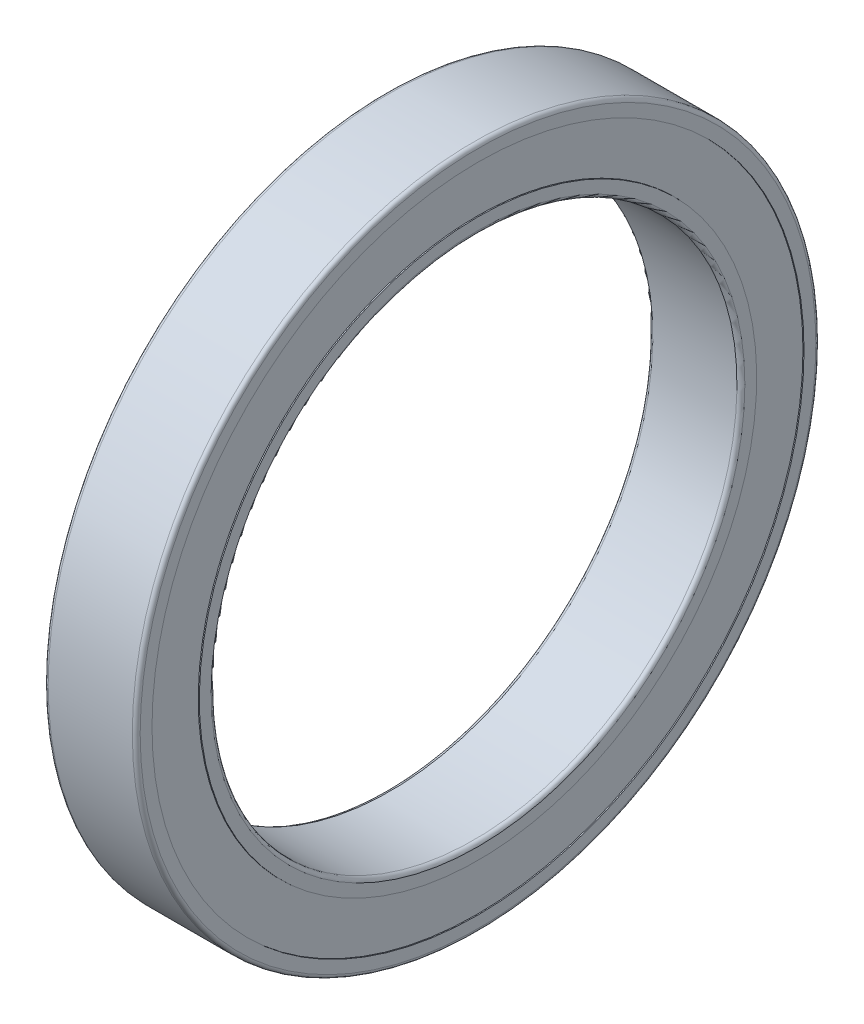
ISO-10303-21;
HEADER;
FILE_DESCRIPTION(('STEP AP214'),'2;1');
FILE_NAME('part.step','',(''),(''),'','','');
FILE_SCHEMA(('AUTOMOTIVE_DESIGN { 1 0 10303 214 1 1 1 1 }'));
ENDSEC;
DATA;
#1=APPLICATION_CONTEXT('core data for automotive mechanical design processes');
#2=APPLICATION_PROTOCOL_DEFINITION('international standard','automotive_design',2000,#1);
#3=PRODUCT_CONTEXT('',#1,'mechanical');
#4=PRODUCT('Part','Part','',(#3));
#5=PRODUCT_RELATED_PRODUCT_CATEGORY('part','',(#4));
#6=PRODUCT_DEFINITION_FORMATION('','',#4);
#7=PRODUCT_DEFINITION_CONTEXT('part definition',#1,'design');
#8=PRODUCT_DEFINITION('design','',#6,#7);
#9=PRODUCT_DEFINITION_SHAPE('','',#8);
#10=(LENGTH_UNIT() NAMED_UNIT(*) SI_UNIT(.MILLI.,.METRE.));
#11=(NAMED_UNIT(*) PLANE_ANGLE_UNIT() SI_UNIT($,.RADIAN.));
#12=(NAMED_UNIT(*) SI_UNIT($,.STERADIAN.) SOLID_ANGLE_UNIT());
#13=UNCERTAINTY_MEASURE_WITH_UNIT(LENGTH_MEASURE(1.E-05),#10,'distance_accuracy_value','');
#14=(GEOMETRIC_REPRESENTATION_CONTEXT(3) GLOBAL_UNCERTAINTY_ASSIGNED_CONTEXT((#13)) GLOBAL_UNIT_ASSIGNED_CONTEXT((#10,
#11,#12)) REPRESENTATION_CONTEXT('',''));
#15=CARTESIAN_POINT('',(0.,0.,0.));
#16=DIRECTION('',(0.,0.,1.));
#17=DIRECTION('',(1.,0.,0.));
#18=AXIS2_PLACEMENT_3D('',#15,#16,#17);
#19=CARTESIAN_POINT('',(3.5,-18.928628915554,-13.065489174817));
#20=DIRECTION('',(-1.,0.,0.));
#21=DIRECTION('',(0.,0.,1.));
#22=AXIS2_PLACEMENT_3D('',#19,#20,#21);
#23=SPHERICAL_SURFACE('',#22,1.5);
#24=CARTESIAN_POINT('',(2.,-18.928628915554,-13.065489174817));
#25=VERTEX_POINT('',#24);
#26=VERTEX_LOOP('',#25);
#27=FACE_BOUND('',#26,.T.);
#28=ADVANCED_FACE('P0_F13',(#27),#23,.T.);
#29=CLOSED_SHELL('',(#28));
#30=MANIFOLD_SOLID_BREP('P0_B1',#29);
#31=CARTESIAN_POINT('',(3.5,-10.688632957007,-20.365488590024));
#32=DIRECTION('',(-1.,0.,0.));
#33=DIRECTION('',(0.,0.,1.));
#34=AXIS2_PLACEMENT_3D('',#31,#32,#33);
#35=SPHERICAL_SURFACE('',#34,1.5);
#36=CARTESIAN_POINT('',(2.,-10.688632957007,-20.365488590024));
#37=VERTEX_POINT('',#36);
#38=VERTEX_LOOP('',#37);
#39=FACE_BOUND('',#38,.T.);
#40=ADVANCED_FACE('P1_F13',(#39),#35,.T.);
#41=CLOSED_SHELL('',(#40));
#42=MANIFOLD_SOLID_BREP('P1_B1',#41);
#43=CARTESIAN_POINT('',(0.,-21.2,21.5938184873471));
#44=DIRECTION('',(-1.,0.,0.));
#45=DIRECTION('',(0.,1.,0.));
#46=AXIS2_PLACEMENT_3D('',#43,#44,#45);
#47=PLANE('',#46);
#48=CARTESIAN_POINT('',(0.,0.,0.));
#49=DIRECTION('',(-1.,0.,0.));
#50=DIRECTION('',(0.,-1.,0.));
#51=AXIS2_PLACEMENT_3D('',#48,#49,#50);
#52=CIRCLE('',#51,21.2);
#53=CARTESIAN_POINT('',(0.,-21.2,0.));
#54=VERTEX_POINT('',#53);
#55=EDGE_CURVE('P2_E56',#54,#54,#52,.F.);
#56=ORIENTED_EDGE('',*,*,#55,.F.);
#57=EDGE_LOOP('',(#56));
#58=FACE_BOUND('',#57,.T.);
#59=CARTESIAN_POINT('',(0.,0.,0.));
#60=DIRECTION('',(1.,0.,0.));
#61=DIRECTION('',(0.,1.,0.));
#62=AXIS2_PLACEMENT_3D('',#59,#60,#61);
#63=CIRCLE('',#62,20.3);
#64=CARTESIAN_POINT('',(0.,20.3,0.));
#65=VERTEX_POINT('',#64);
#66=EDGE_CURVE('P2_E53',#65,#65,#63,.T.);
#67=ORIENTED_EDGE('',*,*,#66,.T.);
#68=EDGE_LOOP('',(#67));
#69=FACE_BOUND('',#68,.T.);
#70=ADVANCED_FACE('P2_F15',(#58,#69),#47,.T.);
#71=CARTESIAN_POINT('',(7.,21.2,21.5938184873471));
#72=DIRECTION('',(1.,0.,0.));
#73=DIRECTION('',(0.,-1.,0.));
#74=AXIS2_PLACEMENT_3D('',#71,#72,#73);
#75=PLANE('',#74);
#76=CARTESIAN_POINT('',(7.,0.,0.));
#77=DIRECTION('',(1.,0.,0.));
#78=DIRECTION('',(0.,1.,0.));
#79=AXIS2_PLACEMENT_3D('',#76,#77,#78);
#80=CIRCLE('',#79,21.2);
#81=CARTESIAN_POINT('',(7.,21.2,0.));
#82=VERTEX_POINT('',#81);
#83=EDGE_CURVE('P2_E50',#82,#82,#80,.T.);
#84=ORIENTED_EDGE('',*,*,#83,.T.);
#85=EDGE_LOOP('',(#84));
#86=FACE_BOUND('',#85,.T.);
#87=CARTESIAN_POINT('',(7.,0.,0.));
#88=DIRECTION('',(-1.,0.,0.));
#89=DIRECTION('',(0.,-1.,0.));
#90=AXIS2_PLACEMENT_3D('',#87,#88,#89);
#91=CIRCLE('',#90,20.3000000077429);
#92=CARTESIAN_POINT('',(7.,-20.3000000077429,0.));
#93=VERTEX_POINT('',#92);
#94=EDGE_CURVE('P2_E47',#93,#93,#91,.F.);
#95=ORIENTED_EDGE('',*,*,#94,.F.);
#96=EDGE_LOOP('',(#95));
#97=FACE_BOUND('',#96,.T.);
#98=ADVANCED_FACE('P2_F64',(#86,#97),#75,.T.);
#99=CARTESIAN_POINT('',(6.678,21.7,22.1031066214671));
#100=DIRECTION('',(1.,0.,0.));
#101=DIRECTION('',(0.,-1.,0.));
#102=AXIS2_PLACEMENT_3D('',#99,#100,#101);
#103=PLANE('',#102);
#104=CARTESIAN_POINT('',(6.678,0.,0.));
#105=DIRECTION('',(1.,0.,0.));
#106=DIRECTION('',(0.,1.,1.16844250608828E-09));
#107=AXIS2_PLACEMENT_3D('',#104,#105,#106);
#108=CIRCLE('',#107,21.7);
#109=CARTESIAN_POINT('',(6.678,21.7,2.53552023821157E-08));
#110=VERTEX_POINT('',#109);
#111=EDGE_CURVE('P2_E44',#110,#110,#108,.T.);
#112=ORIENTED_EDGE('',*,*,#111,.T.);
#113=EDGE_LOOP('',(#112));
#114=FACE_BOUND('',#113,.T.);
#115=CARTESIAN_POINT('',(6.678,0.,0.));
#116=DIRECTION('',(-1.,0.,0.));
#117=DIRECTION('',(0.,-1.,0.));
#118=AXIS2_PLACEMENT_3D('',#115,#116,#117);
#119=CIRCLE('',#118,21.2);
#120=CARTESIAN_POINT('',(6.678,-21.2,0.));
#121=VERTEX_POINT('',#120);
#122=EDGE_CURVE('P2_E41',#121,#121,#119,.F.);
#123=ORIENTED_EDGE('',*,*,#122,.F.);
#124=EDGE_LOOP('',(#123));
#125=FACE_BOUND('',#124,.T.);
#126=ADVANCED_FACE('P2_F82',(#114,#125),#103,.T.);
#127=CARTESIAN_POINT('',(0.322,-21.7,22.1031066592185));
#128=DIRECTION('',(-1.,0.,0.));
#129=DIRECTION('',(0.,1.,0.));
#130=AXIS2_PLACEMENT_3D('',#127,#128,#129);
#131=PLANE('',#130);
#132=CARTESIAN_POINT('',(0.322,0.,0.));
#133=DIRECTION('',(-1.,0.,0.));
#134=DIRECTION('',(0.,-1.,0.));
#135=AXIS2_PLACEMENT_3D('',#132,#133,#134);
#136=CIRCLE('',#135,21.7);
#137=CARTESIAN_POINT('',(0.322,-21.7,0.));
#138=VERTEX_POINT('',#137);
#139=EDGE_CURVE('P2_E38',#138,#138,#136,.F.);
#140=ORIENTED_EDGE('',*,*,#139,.F.);
#141=EDGE_LOOP('',(#140));
#142=FACE_BOUND('',#141,.T.);
#143=CARTESIAN_POINT('',(0.322,0.,0.));
#144=DIRECTION('',(1.,0.,0.));
#145=DIRECTION('',(0.,1.,0.));
#146=AXIS2_PLACEMENT_3D('',#143,#144,#145);
#147=CIRCLE('',#146,21.2);
#148=CARTESIAN_POINT('',(0.322,21.2,0.));
#149=VERTEX_POINT('',#148);
#150=EDGE_CURVE('P2_E35',#149,#149,#147,.T.);
#151=ORIENTED_EDGE('',*,*,#150,.T.);
#152=EDGE_LOOP('',(#151));
#153=FACE_BOUND('',#152,.T.);
#154=ADVANCED_FACE('P2_F71',(#142,#153),#131,.T.);
#155=CARTESIAN_POINT('',(0.299999999999941,0.,0.));
#156=DIRECTION('',(1.,0.,0.));
#157=DIRECTION('',(0.,1.,0.));
#158=AXIS2_PLACEMENT_3D('',#155,#156,#157);
#159=TOROIDAL_SURFACE('',#158,20.3,0.299999999999941);
#160=CARTESIAN_POINT('',(0.3,0.,0.));
#161=DIRECTION('',(1.,0.,0.));
#162=DIRECTION('',(0.,1.,0.));
#163=AXIS2_PLACEMENT_3D('',#160,#161,#162);
#164=CIRCLE('',#163,20.0000000000001);
#165=CARTESIAN_POINT('',(0.3,20.0000000000001,0.));
#166=VERTEX_POINT('',#165);
#167=EDGE_CURVE('P2_E30',#166,#166,#164,.T.);
#168=ORIENTED_EDGE('',*,*,#167,.T.);
#169=EDGE_LOOP('',(#168));
#170=FACE_BOUND('',#169,.T.);
#171=ORIENTED_EDGE('',*,*,#66,.F.);
#172=EDGE_LOOP('',(#171));
#173=FACE_BOUND('',#172,.T.);
#174=ADVANCED_FACE('P2_F68',(#170,#173),#159,.T.);
#175=CARTESIAN_POINT('',(7.,0.,0.));
#176=DIRECTION('',(1.,0.,0.));
#177=DIRECTION('',(0.,1.,0.));
#178=AXIS2_PLACEMENT_3D('',#175,#176,#177);
#179=CYLINDRICAL_SURFACE('',#178,20.);
#180=CARTESIAN_POINT('',(6.7,0.,0.));
#181=DIRECTION('',(1.,0.,0.));
#182=DIRECTION('',(0.,1.,0.));
#183=AXIS2_PLACEMENT_3D('',#180,#181,#182);
#184=CIRCLE('',#183,20.);
#185=CARTESIAN_POINT('',(6.7,20.,0.));
#186=VERTEX_POINT('',#185);
#187=EDGE_CURVE('P2_E26',#186,#186,#184,.T.);
#188=ORIENTED_EDGE('',*,*,#187,.T.);
#189=EDGE_LOOP('',(#188));
#190=FACE_BOUND('',#189,.T.);
#191=ORIENTED_EDGE('',*,*,#167,.F.);
#192=EDGE_LOOP('',(#191));
#193=FACE_BOUND('',#192,.T.);
#194=ADVANCED_FACE('P2_F70',(#190,#193),#179,.F.);
#195=CARTESIAN_POINT('',(6.70000000000012,0.,0.));
#196=DIRECTION('',(1.,0.,0.));
#197=DIRECTION('',(0.,1.,-1.16851696131001E-09));
#198=AXIS2_PLACEMENT_3D('',#195,#196,#197);
#199=TOROIDAL_SURFACE('',#198,20.3,0.29999999999988);
#200=ORIENTED_EDGE('',*,*,#94,.T.);
#201=EDGE_LOOP('',(#200));
#202=FACE_BOUND('',#201,.T.);
#203=ORIENTED_EDGE('',*,*,#187,.F.);
#204=EDGE_LOOP('',(#203));
#205=FACE_BOUND('',#204,.T.);
#206=ADVANCED_FACE('P2_F79',(#202,#205),#199,.T.);
#207=CARTESIAN_POINT('',(7.,0.,0.));
#208=DIRECTION('',(1.,0.,0.));
#209=DIRECTION('',(0.,1.,0.));
#210=AXIS2_PLACEMENT_3D('',#207,#208,#209);
#211=CYLINDRICAL_SURFACE('',#210,21.2);
#212=ORIENTED_EDGE('',*,*,#122,.T.);
#213=EDGE_LOOP('',(#212));
#214=FACE_BOUND('',#213,.T.);
#215=ORIENTED_EDGE('',*,*,#83,.F.);
#216=EDGE_LOOP('',(#215));
#217=FACE_BOUND('',#216,.T.);
#218=ADVANCED_FACE('P2_F89',(#214,#217),#211,.T.);
#219=CARTESIAN_POINT('',(7.,0.,0.));
#220=DIRECTION('',(1.,0.,0.));
#221=DIRECTION('',(0.,1.,0.));
#222=AXIS2_PLACEMENT_3D('',#219,#220,#221);
#223=CYLINDRICAL_SURFACE('',#222,21.7);
#224=CARTESIAN_POINT('',(4.2483314773548,0.,0.));
#225=DIRECTION('',(1.,0.,0.));
#226=DIRECTION('',(0.,1.,0.));
#227=AXIS2_PLACEMENT_3D('',#224,#225,#226);
#228=CIRCLE('',#227,21.7);
#229=CARTESIAN_POINT('',(4.2483314773548,21.7,0.));
#230=VERTEX_POINT('',#229);
#231=EDGE_CURVE('P2_E22',#230,#230,#228,.T.);
#232=ORIENTED_EDGE('',*,*,#231,.T.);
#233=EDGE_LOOP('',(#232));
#234=FACE_BOUND('',#233,.T.);
#235=ORIENTED_EDGE('',*,*,#111,.F.);
#236=EDGE_LOOP('',(#235));
#237=FACE_BOUND('',#236,.T.);
#238=ADVANCED_FACE('P2_F93',(#234,#237),#223,.T.);
#239=CARTESIAN_POINT('',(3.5,0.,0.));
#240=DIRECTION('',(1.,0.,0.));
#241=DIRECTION('',(0.,1.,0.));
#242=AXIS2_PLACEMENT_3D('',#239,#240,#241);
#243=TOROIDAL_SURFACE('',#242,23.,1.50000000000005);
#244=ORIENTED_EDGE('',*,*,#231,.F.);
#245=EDGE_LOOP('',(#244));
#246=FACE_BOUND('',#245,.T.);
#247=CARTESIAN_POINT('',(2.75166852264518,0.,0.));
#248=DIRECTION('',(1.,0.,0.));
#249=DIRECTION('',(0.,1.,0.));
#250=AXIS2_PLACEMENT_3D('',#247,#248,#249);
#251=CIRCLE('',#250,21.7);
#252=CARTESIAN_POINT('',(2.75166852264518,21.7,0.));
#253=VERTEX_POINT('',#252);
#254=EDGE_CURVE('P2_E10',#253,#253,#251,.T.);
#255=ORIENTED_EDGE('',*,*,#254,.T.);
#256=EDGE_LOOP('',(#255));
#257=FACE_BOUND('',#256,.T.);
#258=ADVANCED_FACE('P2_F97',(#246,#257),#243,.F.);
#259=CARTESIAN_POINT('',(7.,0.,0.));
#260=DIRECTION('',(1.,0.,0.));
#261=DIRECTION('',(0.,1.,0.));
#262=AXIS2_PLACEMENT_3D('',#259,#260,#261);
#263=CYLINDRICAL_SURFACE('',#262,21.7);
#264=ORIENTED_EDGE('',*,*,#139,.T.);
#265=EDGE_LOOP('',(#264));
#266=FACE_BOUND('',#265,.T.);
#267=ORIENTED_EDGE('',*,*,#254,.F.);
#268=EDGE_LOOP('',(#267));
#269=FACE_BOUND('',#268,.T.);
#270=ADVANCED_FACE('P2_F99',(#266,#269),#263,.T.);
#271=CARTESIAN_POINT('',(7.,0.,0.));
#272=DIRECTION('',(1.,0.,0.));
#273=DIRECTION('',(0.,1.,0.));
#274=AXIS2_PLACEMENT_3D('',#271,#272,#273);
#275=CYLINDRICAL_SURFACE('',#274,21.2);
#276=ORIENTED_EDGE('',*,*,#55,.T.);
#277=EDGE_LOOP('',(#276));
#278=FACE_BOUND('',#277,.T.);
#279=ORIENTED_EDGE('',*,*,#150,.F.);
#280=EDGE_LOOP('',(#279));
#281=FACE_BOUND('',#280,.T.);
#282=ADVANCED_FACE('P2_F17',(#278,#281),#275,.T.);
#283=CLOSED_SHELL('',(#70,#98,#126,#154,#174,#194,#206,#218,#238,#258,#270,#282));
#284=MANIFOLD_SOLID_BREP('P2_B1',#283);
#285=CARTESIAN_POINT('',(3.5,5.5042602786138,22.331661800799));
#286=DIRECTION('',(-1.,0.,0.));
#287=DIRECTION('',(0.,0.,1.));
#288=AXIS2_PLACEMENT_3D('',#285,#286,#287);
#289=SPHERICAL_SURFACE('',#288,1.5);
#290=CARTESIAN_POINT('',(2.,5.5042602786138,22.331661800799));
#291=VERTEX_POINT('',#290);
#292=VERTEX_LOOP('',#291);
#293=FACE_BOUND('',#292,.T.);
#294=ADVANCED_FACE('P3_F13',(#293),#289,.T.);
#295=CLOSED_SHELL('',(#294));
#296=MANIFOLD_SOLID_BREP('P3_B1',#295);
#297=CARTESIAN_POINT('',(3.5,21.505373581765,8.1559124019783));
#298=DIRECTION('',(-1.,0.,0.));
#299=DIRECTION('',(0.,0.,1.));
#300=AXIS2_PLACEMENT_3D('',#297,#298,#299);
#301=SPHERICAL_SURFACE('',#300,1.5);
#302=CARTESIAN_POINT('',(2.,21.505373581765,8.1559124019783));
#303=VERTEX_POINT('',#302);
#304=VERTEX_LOOP('',#303);
#305=FACE_BOUND('',#304,.T.);
#306=ADVANCED_FACE('P4_F13',(#305),#301,.T.);
#307=CLOSED_SHELL('',(#306));
#308=MANIFOLD_SOLID_BREP('P4_B1',#307);
#309=CARTESIAN_POINT('',(3.5,0.,-23.));
#310=DIRECTION('',(-1.,0.,0.));
#311=DIRECTION('',(0.,0.,1.));
#312=AXIS2_PLACEMENT_3D('',#309,#310,#311);
#313=SPHERICAL_SURFACE('',#312,1.5);
#314=CARTESIAN_POINT('',(2.,0.,-23.));
#315=VERTEX_POINT('',#314);
#316=VERTEX_LOOP('',#315);
#317=FACE_BOUND('',#316,.T.);
#318=ADVANCED_FACE('P5_F13',(#317),#313,.T.);
#319=CLOSED_SHELL('',(#318));
#320=MANIFOLD_SOLID_BREP('P5_B1',#319);
#321=CARTESIAN_POINT('',(3.5,10.688632957007,-20.365488590024));
#322=DIRECTION('',(-1.,0.,0.));
#323=DIRECTION('',(0.,0.,1.));
#324=AXIS2_PLACEMENT_3D('',#321,#322,#323);
#325=SPHERICAL_SURFACE('',#324,1.5);
#326=CARTESIAN_POINT('',(2.,10.688632957007,-20.365488590024));
#327=VERTEX_POINT('',#326);
#328=VERTEX_LOOP('',#327);
#329=FACE_BOUND('',#328,.T.);
#330=ADVANCED_FACE('P6_F13',(#329),#325,.T.);
#331=CLOSED_SHELL('',(#330));
#332=MANIFOLD_SOLID_BREP('P6_B1',#331);
#333=CARTESIAN_POINT('',(3.5,18.928628915554,-13.065489174817));
#334=DIRECTION('',(-1.,0.,0.));
#335=DIRECTION('',(0.,0.,1.));
#336=AXIS2_PLACEMENT_3D('',#333,#334,#335);
#337=SPHERICAL_SURFACE('',#336,1.5);
#338=CARTESIAN_POINT('',(2.,18.928628915554,-13.065489174817));
#339=VERTEX_POINT('',#338);
#340=VERTEX_LOOP('',#339);
#341=FACE_BOUND('',#340,.T.);
#342=ADVANCED_FACE('P7_F13',(#341),#337,.T.);
#343=CLOSED_SHELL('',(#342));
#344=MANIFOLD_SOLID_BREP('P7_B1',#343);
#345=CARTESIAN_POINT('',(3.5,22.832304104255,-2.7723436458724));
#346=DIRECTION('',(-1.,0.,0.));
#347=DIRECTION('',(0.,0.,1.));
#348=AXIS2_PLACEMENT_3D('',#345,#346,#347);
#349=SPHERICAL_SURFACE('',#348,1.5);
#350=CARTESIAN_POINT('',(2.,22.832304104255,-2.7723436458724));
#351=VERTEX_POINT('',#350);
#352=VERTEX_LOOP('',#351);
#353=FACE_BOUND('',#352,.T.);
#354=ADVANCED_FACE('P8_F13',(#353),#349,.T.);
#355=CLOSED_SHELL('',(#354));
#356=MANIFOLD_SOLID_BREP('P8_B1',#355);
#357=CARTESIAN_POINT('',(3.5,-15.251821139538,17.215747207935));
#358=DIRECTION('',(-1.,0.,0.));
#359=DIRECTION('',(0.,0.,1.));
#360=AXIS2_PLACEMENT_3D('',#357,#358,#359);
#361=SPHERICAL_SURFACE('',#360,1.5);
#362=CARTESIAN_POINT('',(2.,-15.251821139538,17.215747207935));
#363=VERTEX_POINT('',#362);
#364=VERTEX_LOOP('',#363);
#365=FACE_BOUND('',#364,.T.);
#366=ADVANCED_FACE('P9_F13',(#365),#361,.T.);
#367=CLOSED_SHELL('',(#366));
#368=MANIFOLD_SOLID_BREP('P9_B1',#367);
#369=CARTESIAN_POINT('',(6.678,-25.2606933248211,-24.8));
#370=DIRECTION('',(-1.,0.,0.));
#371=DIRECTION('',(0.,0.,1.));
#372=AXIS2_PLACEMENT_3D('',#369,#370,#371);
#373=PLANE('',#372);
#374=CARTESIAN_POINT('',(6.678,0.,0.));
#375=DIRECTION('',(-1.,0.,0.));
#376=DIRECTION('',(0.,0.,-1.));
#377=AXIS2_PLACEMENT_3D('',#374,#375,#376);
#378=CIRCLE('',#377,24.8);
#379=CARTESIAN_POINT('',(6.678,0.,-24.8));
#380=VERTEX_POINT('',#379);
#381=EDGE_CURVE('P10_E30',#380,#380,#378,.F.);
#382=ORIENTED_EDGE('',*,*,#381,.F.);
#383=EDGE_LOOP('',(#382));
#384=FACE_BOUND('',#383,.T.);
#385=CARTESIAN_POINT('',(6.678,0.,0.));
#386=DIRECTION('',(1.,0.,0.));
#387=DIRECTION('',(0.,0.,1.));
#388=AXIS2_PLACEMENT_3D('',#385,#386,#387);
#389=CIRCLE('',#388,21.2);
#390=CARTESIAN_POINT('',(6.678,0.,21.2));
#391=VERTEX_POINT('',#390);
#392=EDGE_CURVE('P10_E26',#391,#391,#389,.T.);
#393=ORIENTED_EDGE('',*,*,#392,.T.);
#394=EDGE_LOOP('',(#393));
#395=FACE_BOUND('',#394,.T.);
#396=ADVANCED_FACE('P10_F15',(#384,#395),#373,.T.);
#397=CARTESIAN_POINT('',(6.9195,-25.2606933248211,24.8));
#398=DIRECTION('',(1.,0.,0.));
#399=DIRECTION('',(0.,0.,-1.));
#400=AXIS2_PLACEMENT_3D('',#397,#398,#399);
#401=PLANE('',#400);
#402=CARTESIAN_POINT('',(6.9195,0.,0.));
#403=DIRECTION('',(1.,0.,0.));
#404=DIRECTION('',(0.,0.,1.));
#405=AXIS2_PLACEMENT_3D('',#402,#403,#404);
#406=CIRCLE('',#405,24.8);
#407=CARTESIAN_POINT('',(6.9195,0.,24.8));
#408=VERTEX_POINT('',#407);
#409=EDGE_CURVE('P10_E22',#408,#408,#406,.T.);
#410=ORIENTED_EDGE('',*,*,#409,.T.);
#411=EDGE_LOOP('',(#410));
#412=FACE_BOUND('',#411,.T.);
#413=CARTESIAN_POINT('',(6.9195,0.,0.));
#414=DIRECTION('',(-1.,0.,0.));
#415=DIRECTION('',(0.,0.,-1.));
#416=AXIS2_PLACEMENT_3D('',#413,#414,#415);
#417=CIRCLE('',#416,21.2);
#418=CARTESIAN_POINT('',(6.9195,0.,-21.2));
#419=VERTEX_POINT('',#418);
#420=EDGE_CURVE('P10_E10',#419,#419,#417,.F.);
#421=ORIENTED_EDGE('',*,*,#420,.F.);
#422=EDGE_LOOP('',(#421));
#423=FACE_BOUND('',#422,.T.);
#424=ADVANCED_FACE('P10_F40',(#412,#423),#401,.T.);
#425=CARTESIAN_POINT('',(6.9195,0.,0.));
#426=DIRECTION('',(1.,0.,0.));
#427=DIRECTION('',(0.,0.,1.));
#428=AXIS2_PLACEMENT_3D('',#425,#426,#427);
#429=CYLINDRICAL_SURFACE('',#428,21.2);
#430=ORIENTED_EDGE('',*,*,#420,.T.);
#431=EDGE_LOOP('',(#430));
#432=FACE_BOUND('',#431,.T.);
#433=ORIENTED_EDGE('',*,*,#392,.F.);
#434=EDGE_LOOP('',(#433));
#435=FACE_BOUND('',#434,.T.);
#436=ADVANCED_FACE('P10_F44',(#432,#435),#429,.F.);
#437=CARTESIAN_POINT('',(6.9195,0.,0.));
#438=DIRECTION('',(1.,0.,0.));
#439=DIRECTION('',(0.,0.,1.));
#440=AXIS2_PLACEMENT_3D('',#437,#438,#439);
#441=CYLINDRICAL_SURFACE('',#440,24.8);
#442=ORIENTED_EDGE('',*,*,#381,.T.);
#443=EDGE_LOOP('',(#442));
#444=FACE_BOUND('',#443,.T.);
#445=ORIENTED_EDGE('',*,*,#409,.F.);
#446=EDGE_LOOP('',(#445));
#447=FACE_BOUND('',#446,.T.);
#448=ADVANCED_FACE('P10_F17',(#444,#447),#441,.T.);
#449=CLOSED_SHELL('',(#396,#424,#436,#448));
#450=MANIFOLD_SOLID_BREP('P10_B1',#449);
#451=CARTESIAN_POINT('',(0.322,25.2606933248211,-24.8));
#452=DIRECTION('',(1.,0.,0.));
#453=DIRECTION('',(0.,0.,1.));
#454=AXIS2_PLACEMENT_3D('',#451,#452,#453);
#455=PLANE('',#454);
#456=CARTESIAN_POINT('',(0.322,0.,0.));
#457=DIRECTION('',(1.,0.,0.));
#458=DIRECTION('',(0.,0.,-1.));
#459=AXIS2_PLACEMENT_3D('',#456,#457,#458);
#460=CIRCLE('',#459,24.8);
#461=CARTESIAN_POINT('',(0.322,0.,-24.8));
#462=VERTEX_POINT('',#461);
#463=EDGE_CURVE('P11_E30',#462,#462,#460,.F.);
#464=ORIENTED_EDGE('',*,*,#463,.F.);
#465=EDGE_LOOP('',(#464));
#466=FACE_BOUND('',#465,.T.);
#467=CARTESIAN_POINT('',(0.322,0.,0.));
#468=DIRECTION('',(-1.,0.,0.));
#469=DIRECTION('',(0.,0.,1.));
#470=AXIS2_PLACEMENT_3D('',#467,#468,#469);
#471=CIRCLE('',#470,21.2);
#472=CARTESIAN_POINT('',(0.322,0.,21.2));
#473=VERTEX_POINT('',#472);
#474=EDGE_CURVE('P11_E26',#473,#473,#471,.T.);
#475=ORIENTED_EDGE('',*,*,#474,.T.);
#476=EDGE_LOOP('',(#475));
#477=FACE_BOUND('',#476,.T.);
#478=ADVANCED_FACE('P11_F15',(#466,#477),#455,.T.);
#479=CARTESIAN_POINT('',(0.0805,25.2606933248211,24.8));
#480=DIRECTION('',(-1.,0.,0.));
#481=DIRECTION('',(0.,0.,-1.));
#482=AXIS2_PLACEMENT_3D('',#479,#480,#481);
#483=PLANE('',#482);
#484=CARTESIAN_POINT('',(0.0805,0.,0.));
#485=DIRECTION('',(-1.,0.,0.));
#486=DIRECTION('',(0.,0.,1.));
#487=AXIS2_PLACEMENT_3D('',#484,#485,#486);
#488=CIRCLE('',#487,24.8);
#489=CARTESIAN_POINT('',(0.0805,0.,24.8));
#490=VERTEX_POINT('',#489);
#491=EDGE_CURVE('P11_E22',#490,#490,#488,.T.);
#492=ORIENTED_EDGE('',*,*,#491,.T.);
#493=EDGE_LOOP('',(#492));
#494=FACE_BOUND('',#493,.T.);
#495=CARTESIAN_POINT('',(0.0805,0.,0.));
#496=DIRECTION('',(1.,0.,0.));
#497=DIRECTION('',(0.,0.,-1.));
#498=AXIS2_PLACEMENT_3D('',#495,#496,#497);
#499=CIRCLE('',#498,21.2);
#500=CARTESIAN_POINT('',(0.0805,0.,-21.2));
#501=VERTEX_POINT('',#500);
#502=EDGE_CURVE('P11_E10',#501,#501,#499,.F.);
#503=ORIENTED_EDGE('',*,*,#502,.F.);
#504=EDGE_LOOP('',(#503));
#505=FACE_BOUND('',#504,.T.);
#506=ADVANCED_FACE('P11_F40',(#494,#505),#483,.T.);
#507=CARTESIAN_POINT('',(0.0805,0.,0.));
#508=DIRECTION('',(-1.,0.,0.));
#509=DIRECTION('',(0.,0.,1.));
#510=AXIS2_PLACEMENT_3D('',#507,#508,#509);
#511=CYLINDRICAL_SURFACE('',#510,21.2);
#512=ORIENTED_EDGE('',*,*,#502,.T.);
#513=EDGE_LOOP('',(#512));
#514=FACE_BOUND('',#513,.T.);
#515=ORIENTED_EDGE('',*,*,#474,.F.);
#516=EDGE_LOOP('',(#515));
#517=FACE_BOUND('',#516,.T.);
#518=ADVANCED_FACE('P11_F44',(#514,#517),#511,.F.);
#519=CARTESIAN_POINT('',(0.0805,0.,0.));
#520=DIRECTION('',(-1.,0.,0.));
#521=DIRECTION('',(0.,0.,1.));
#522=AXIS2_PLACEMENT_3D('',#519,#520,#521);
#523=CYLINDRICAL_SURFACE('',#522,24.8);
#524=ORIENTED_EDGE('',*,*,#463,.T.);
#525=EDGE_LOOP('',(#524));
#526=FACE_BOUND('',#525,.T.);
#527=ORIENTED_EDGE('',*,*,#491,.F.);
#528=EDGE_LOOP('',(#527));
#529=FACE_BOUND('',#528,.T.);
#530=ADVANCED_FACE('P11_F17',(#526,#529),#523,.T.);
#531=CLOSED_SHELL('',(#478,#506,#518,#530));
#532=MANIFOLD_SOLID_BREP('P11_B1',#531);
#533=CARTESIAN_POINT('',(3.5,15.251821139538,17.215747207935));
#534=DIRECTION('',(-1.,0.,0.));
#535=DIRECTION('',(0.,0.,1.));
#536=AXIS2_PLACEMENT_3D('',#533,#534,#535);
#537=SPHERICAL_SURFACE('',#536,1.5);
#538=CARTESIAN_POINT('',(2.,15.251821139538,17.215747207935));
#539=VERTEX_POINT('',#538);
#540=VERTEX_LOOP('',#539);
#541=FACE_BOUND('',#540,.T.);
#542=ADVANCED_FACE('P12_F13',(#541),#537,.T.);
#543=CLOSED_SHELL('',(#542));
#544=MANIFOLD_SOLID_BREP('P12_B1',#543);
#545=CARTESIAN_POINT('',(3.5,-22.832304104255,-2.7723436458724));
#546=DIRECTION('',(-1.,0.,0.));
#547=DIRECTION('',(0.,0.,1.));
#548=AXIS2_PLACEMENT_3D('',#545,#546,#547);
#549=SPHERICAL_SURFACE('',#548,1.5);
#550=CARTESIAN_POINT('',(2.,-22.832304104255,-2.7723436458724));
#551=VERTEX_POINT('',#550);
#552=VERTEX_LOOP('',#551);
#553=FACE_BOUND('',#552,.T.);
#554=ADVANCED_FACE('P13_F13',(#553),#549,.T.);
#555=CLOSED_SHELL('',(#554));
#556=MANIFOLD_SOLID_BREP('P13_B1',#555);
#557=CARTESIAN_POINT('',(0.,-26.1774120341896,-25.7));
#558=DIRECTION('',(-1.,0.,0.));
#559=DIRECTION('',(0.,0.,1.));
#560=AXIS2_PLACEMENT_3D('',#557,#558,#559);
#561=PLANE('',#560);
#562=CARTESIAN_POINT('',(0.,0.,0.));
#563=DIRECTION('',(-1.,0.,0.));
#564=DIRECTION('',(0.,0.,-1.));
#565=AXIS2_PLACEMENT_3D('',#562,#563,#564);
#566=CIRCLE('',#565,25.7000000173136);
#567=CARTESIAN_POINT('',(0.,0.,-25.7000000173136));
#568=VERTEX_POINT('',#567);
#569=EDGE_CURVE('P14_E55',#568,#568,#566,.F.);
#570=ORIENTED_EDGE('',*,*,#569,.F.);
#571=EDGE_LOOP('',(#570));
#572=FACE_BOUND('',#571,.T.);
#573=CARTESIAN_POINT('',(0.,0.,0.));
#574=DIRECTION('',(1.,0.,0.));
#575=DIRECTION('',(0.,0.,1.));
#576=AXIS2_PLACEMENT_3D('',#573,#574,#575);
#577=CIRCLE('',#576,24.8);
#578=CARTESIAN_POINT('',(0.,0.,24.8));
#579=VERTEX_POINT('',#578);
#580=EDGE_CURVE('P14_E52',#579,#579,#577,.T.);
#581=ORIENTED_EDGE('',*,*,#580,.T.);
#582=EDGE_LOOP('',(#581));
#583=FACE_BOUND('',#582,.T.);
#584=ADVANCED_FACE('P14_F14',(#572,#583),#561,.T.);
#585=CARTESIAN_POINT('',(0.322,-25.2606933248211,-24.8));
#586=DIRECTION('',(-1.,0.,0.));
#587=DIRECTION('',(0.,0.,1.));
#588=AXIS2_PLACEMENT_3D('',#585,#586,#587);
#589=PLANE('',#588);
#590=CARTESIAN_POINT('',(0.322,0.,0.));
#591=DIRECTION('',(-1.,0.,0.));
#592=DIRECTION('',(0.,0.,-1.));
#593=AXIS2_PLACEMENT_3D('',#590,#591,#592);
#594=CIRCLE('',#593,24.8);
#595=CARTESIAN_POINT('',(0.322,0.,-24.8));
#596=VERTEX_POINT('',#595);
#597=EDGE_CURVE('P14_E49',#596,#596,#594,.F.);
#598=ORIENTED_EDGE('',*,*,#597,.F.);
#599=EDGE_LOOP('',(#598));
#600=FACE_BOUND('',#599,.T.);
#601=CARTESIAN_POINT('',(0.322,0.,0.));
#602=DIRECTION('',(1.,0.,0.));
#603=DIRECTION('',(0.,0.,1.));
#604=AXIS2_PLACEMENT_3D('',#601,#602,#603);
#605=CIRCLE('',#604,24.25);
#606=CARTESIAN_POINT('',(0.322,0.,24.25));
#607=VERTEX_POINT('',#606);
#608=EDGE_CURVE('P14_E46',#607,#607,#605,.T.);
#609=ORIENTED_EDGE('',*,*,#608,.T.);
#610=EDGE_LOOP('',(#609));
#611=FACE_BOUND('',#610,.T.);
#612=ADVANCED_FACE('P14_F63',(#600,#611),#589,.T.);
#613=CARTESIAN_POINT('',(6.678,-25.2606933248211,24.8));
#614=DIRECTION('',(1.,0.,0.));
#615=DIRECTION('',(0.,0.,-1.));
#616=AXIS2_PLACEMENT_3D('',#613,#614,#615);
#617=PLANE('',#616);
#618=CARTESIAN_POINT('',(6.678,0.,0.));
#619=DIRECTION('',(1.,0.,0.));
#620=DIRECTION('',(0.,0.,1.));
#621=AXIS2_PLACEMENT_3D('',#618,#619,#620);
#622=CIRCLE('',#621,24.8);
#623=CARTESIAN_POINT('',(6.678,0.,24.8));
#624=VERTEX_POINT('',#623);
#625=EDGE_CURVE('P14_E43',#624,#624,#622,.T.);
#626=ORIENTED_EDGE('',*,*,#625,.T.);
#627=EDGE_LOOP('',(#626));
#628=FACE_BOUND('',#627,.T.);
#629=CARTESIAN_POINT('',(6.678,0.,0.));
#630=DIRECTION('',(-1.,0.,0.));
#631=DIRECTION('',(0.,0.,-1.));
#632=AXIS2_PLACEMENT_3D('',#629,#630,#631);
#633=CIRCLE('',#632,24.25);
#634=CARTESIAN_POINT('',(6.678,0.,-24.25));
#635=VERTEX_POINT('',#634);
#636=EDGE_CURVE('P14_E40',#635,#635,#633,.F.);
#637=ORIENTED_EDGE('',*,*,#636,.F.);
#638=EDGE_LOOP('',(#637));
#639=FACE_BOUND('',#638,.T.);
#640=ADVANCED_FACE('P14_F82',(#628,#639),#617,.T.);
#641=CARTESIAN_POINT('',(7.,-26.1774119894821,25.7));
#642=DIRECTION('',(1.,0.,0.));
#643=DIRECTION('',(0.,0.,-1.));
#644=AXIS2_PLACEMENT_3D('',#641,#642,#643);
#645=PLANE('',#644);
#646=CARTESIAN_POINT('',(7.,0.,0.));
#647=DIRECTION('',(1.,0.,0.));
#648=DIRECTION('',(0.,-1.16837265327394E-09,1.));
#649=AXIS2_PLACEMENT_3D('',#646,#647,#648);
#650=CIRCLE('',#649,25.7);
#651=CARTESIAN_POINT('',(7.,-3.00271771891403E-08,25.7));
#652=VERTEX_POINT('',#651);
#653=EDGE_CURVE('P14_E37',#652,#652,#650,.T.);
#654=ORIENTED_EDGE('',*,*,#653,.T.);
#655=EDGE_LOOP('',(#654));
#656=FACE_BOUND('',#655,.T.);
#657=CARTESIAN_POINT('',(7.,0.,0.));
#658=DIRECTION('',(-1.,0.,0.));
#659=DIRECTION('',(0.,0.,-1.));
#660=AXIS2_PLACEMENT_3D('',#657,#658,#659);
#661=CIRCLE('',#660,24.8);
#662=CARTESIAN_POINT('',(7.,0.,-24.8));
#663=VERTEX_POINT('',#662);
#664=EDGE_CURVE('P14_E34',#663,#663,#661,.F.);
#665=ORIENTED_EDGE('',*,*,#664,.F.);
#666=EDGE_LOOP('',(#665));
#667=FACE_BOUND('',#666,.T.);
#668=ADVANCED_FACE('P14_F70',(#656,#667),#645,.T.);
#669=CARTESIAN_POINT('',(7.,0.,0.));
#670=DIRECTION('',(1.,0.,0.));
#671=DIRECTION('',(0.,0.,1.));
#672=AXIS2_PLACEMENT_3D('',#669,#670,#671);
#673=CYLINDRICAL_SURFACE('',#672,24.8);
#674=ORIENTED_EDGE('',*,*,#597,.T.);
#675=EDGE_LOOP('',(#674));
#676=FACE_BOUND('',#675,.T.);
#677=ORIENTED_EDGE('',*,*,#580,.F.);
#678=EDGE_LOOP('',(#677));
#679=FACE_BOUND('',#678,.T.);
#680=ADVANCED_FACE('P14_F67',(#676,#679),#673,.F.);
#681=CARTESIAN_POINT('',(7.,0.,0.));
#682=DIRECTION('',(1.,0.,0.));
#683=DIRECTION('',(0.,0.,1.));
#684=AXIS2_PLACEMENT_3D('',#681,#682,#683);
#685=CYLINDRICAL_SURFACE('',#684,24.25);
#686=CARTESIAN_POINT('',(2.6708438024112,0.,0.));
#687=DIRECTION('',(1.,0.,0.));
#688=DIRECTION('',(0.,0.,1.));
#689=AXIS2_PLACEMENT_3D('',#686,#687,#688);
#690=CIRCLE('',#689,24.25);
#691=CARTESIAN_POINT('',(2.6708438024112,0.,24.25));
#692=VERTEX_POINT('',#691);
#693=EDGE_CURVE('P14_E29',#692,#692,#690,.T.);
#694=ORIENTED_EDGE('',*,*,#693,.T.);
#695=EDGE_LOOP('',(#694));
#696=FACE_BOUND('',#695,.T.);
#697=ORIENTED_EDGE('',*,*,#608,.F.);
#698=EDGE_LOOP('',(#697));
#699=FACE_BOUND('',#698,.T.);
#700=ADVANCED_FACE('P14_F69',(#696,#699),#685,.F.);
#701=CARTESIAN_POINT('',(3.5,0.,0.));
#702=DIRECTION('',(1.,0.,0.));
#703=DIRECTION('',(0.,0.,1.));
#704=AXIS2_PLACEMENT_3D('',#701,#702,#703);
#705=TOROIDAL_SURFACE('',#704,23.,1.49999999999983);
#706=ORIENTED_EDGE('',*,*,#693,.F.);
#707=EDGE_LOOP('',(#706));
#708=FACE_BOUND('',#707,.T.);
#709=CARTESIAN_POINT('',(4.32915619758871,0.,0.));
#710=DIRECTION('',(1.,0.,0.));
#711=DIRECTION('',(0.,-1.92336246589012E-10,1.));
#712=AXIS2_PLACEMENT_3D('',#709,#710,#711);
#713=CIRCLE('',#712,24.2499999999999);
#714=CARTESIAN_POINT('',(4.32915619758871,-4.66415397978351E-09,24.2499999999999));
#715=VERTEX_POINT('',#714);
#716=EDGE_CURVE('P14_E25',#715,#715,#713,.T.);
#717=ORIENTED_EDGE('',*,*,#716,.T.);
#718=EDGE_LOOP('',(#717));
#719=FACE_BOUND('',#718,.T.);
#720=ADVANCED_FACE('P14_F79',(#708,#719),#705,.F.);
#721=CARTESIAN_POINT('',(7.,0.,0.));
#722=DIRECTION('',(1.,0.,0.));
#723=DIRECTION('',(0.,0.,1.));
#724=AXIS2_PLACEMENT_3D('',#721,#722,#723);
#725=CYLINDRICAL_SURFACE('',#724,24.25);
#726=ORIENTED_EDGE('',*,*,#636,.T.);
#727=EDGE_LOOP('',(#726));
#728=FACE_BOUND('',#727,.T.);
#729=ORIENTED_EDGE('',*,*,#716,.F.);
#730=EDGE_LOOP('',(#729));
#731=FACE_BOUND('',#730,.T.);
#732=ADVANCED_FACE('P14_F89',(#728,#731),#725,.F.);
#733=CARTESIAN_POINT('',(7.,0.,0.));
#734=DIRECTION('',(1.,0.,0.));
#735=DIRECTION('',(0.,0.,1.));
#736=AXIS2_PLACEMENT_3D('',#733,#734,#735);
#737=CYLINDRICAL_SURFACE('',#736,24.8);
#738=ORIENTED_EDGE('',*,*,#664,.T.);
#739=EDGE_LOOP('',(#738));
#740=FACE_BOUND('',#739,.T.);
#741=ORIENTED_EDGE('',*,*,#625,.F.);
#742=EDGE_LOOP('',(#741));
#743=FACE_BOUND('',#742,.T.);
#744=ADVANCED_FACE('P14_F93',(#740,#743),#737,.F.);
#745=CARTESIAN_POINT('',(6.70000000000011,0.,0.));
#746=DIRECTION('',(1.,0.,0.));
#747=DIRECTION('',(0.,0.,1.));
#748=AXIS2_PLACEMENT_3D('',#745,#746,#747);
#749=TOROIDAL_SURFACE('',#748,25.7,0.299999999999887);
#750=CARTESIAN_POINT('',(6.70000000000011,0.,0.));
#751=DIRECTION('',(1.,0.,0.));
#752=DIRECTION('',(0.,0.,1.));
#753=AXIS2_PLACEMENT_3D('',#750,#751,#752);
#754=CIRCLE('',#753,25.9999999999999);
#755=CARTESIAN_POINT('',(6.70000000000011,0.,25.9999999999999));
#756=VERTEX_POINT('',#755);
#757=EDGE_CURVE('P14_E21',#756,#756,#754,.T.);
#758=ORIENTED_EDGE('',*,*,#757,.T.);
#759=EDGE_LOOP('',(#758));
#760=FACE_BOUND('',#759,.T.);
#761=ORIENTED_EDGE('',*,*,#653,.F.);
#762=EDGE_LOOP('',(#761));
#763=FACE_BOUND('',#762,.T.);
#764=ADVANCED_FACE('P14_F97',(#760,#763),#749,.T.);
#765=CARTESIAN_POINT('',(7.,0.,0.));
#766=DIRECTION('',(1.,0.,0.));
#767=DIRECTION('',(0.,0.,1.));
#768=AXIS2_PLACEMENT_3D('',#765,#766,#767);
#769=CYLINDRICAL_SURFACE('',#768,26.);
#770=CARTESIAN_POINT('',(0.299999999999974,0.,0.));
#771=DIRECTION('',(1.,0.,0.));
#772=DIRECTION('',(0.,0.,1.));
#773=AXIS2_PLACEMENT_3D('',#770,#771,#772);
#774=CIRCLE('',#773,26.);
#775=CARTESIAN_POINT('',(0.299999999999974,0.,26.));
#776=VERTEX_POINT('',#775);
#777=EDGE_CURVE('P14_E9',#776,#776,#774,.T.);
#778=ORIENTED_EDGE('',*,*,#777,.T.);
#779=EDGE_LOOP('',(#778));
#780=FACE_BOUND('',#779,.T.);
#781=ORIENTED_EDGE('',*,*,#757,.F.);
#782=EDGE_LOOP('',(#781));
#783=FACE_BOUND('',#782,.T.);
#784=ADVANCED_FACE('P14_F100',(#780,#783),#769,.T.);
#785=CARTESIAN_POINT('',(0.299999999999948,0.,0.));
#786=DIRECTION('',(1.,0.,0.));
#787=DIRECTION('',(0.,0.,1.));
#788=AXIS2_PLACEMENT_3D('',#785,#786,#787);
#789=TOROIDAL_SURFACE('',#788,25.7,0.29999999999995);
#790=ORIENTED_EDGE('',*,*,#569,.T.);
#791=EDGE_LOOP('',(#790));
#792=FACE_BOUND('',#791,.T.);
#793=ORIENTED_EDGE('',*,*,#777,.F.);
#794=EDGE_LOOP('',(#793));
#795=FACE_BOUND('',#794,.T.);
#796=ADVANCED_FACE('P14_F16',(#792,#795),#789,.T.);
#797=CLOSED_SHELL('',(#584,#612,#640,#668,#680,#700,#720,#732,#744,#764,#784,#796));
#798=MANIFOLD_SOLID_BREP('P14_B1',#797);
#799=CARTESIAN_POINT('',(3.5,-5.5042602786138,22.331661800799));
#800=DIRECTION('',(-1.,0.,0.));
#801=DIRECTION('',(0.,0.,1.));
#802=AXIS2_PLACEMENT_3D('',#799,#800,#801);
#803=SPHERICAL_SURFACE('',#802,1.5);
#804=CARTESIAN_POINT('',(2.,-5.5042602786138,22.331661800799));
#805=VERTEX_POINT('',#804);
#806=VERTEX_LOOP('',#805);
#807=FACE_BOUND('',#806,.T.);
#808=ADVANCED_FACE('P15_F13',(#807),#803,.T.);
#809=CLOSED_SHELL('',(#808));
#810=MANIFOLD_SOLID_BREP('P15_B1',#809);
#811=CARTESIAN_POINT('',(3.5,-21.505373581765,8.1559124019783));
#812=DIRECTION('',(-1.,0.,0.));
#813=DIRECTION('',(0.,0.,1.));
#814=AXIS2_PLACEMENT_3D('',#811,#812,#813);
#815=SPHERICAL_SURFACE('',#814,1.5);
#816=CARTESIAN_POINT('',(2.,-21.505373581765,8.1559124019783));
#817=VERTEX_POINT('',#816);
#818=VERTEX_LOOP('',#817);
#819=FACE_BOUND('',#818,.T.);
#820=ADVANCED_FACE('P16_F13',(#819),#815,.T.);
#821=CLOSED_SHELL('',(#820));
#822=MANIFOLD_SOLID_BREP('P16_B1',#821);
#823=ADVANCED_BREP_SHAPE_REPRESENTATION('',(#18,#30,#42,#284,#296,#308,#320,#332,#344,#356,#368,
#450,#532,#544,#556,#798,#810,#822),#14);
#824=SHAPE_DEFINITION_REPRESENTATION(#9,#823);
ENDSEC;
END-ISO-10303-21;
